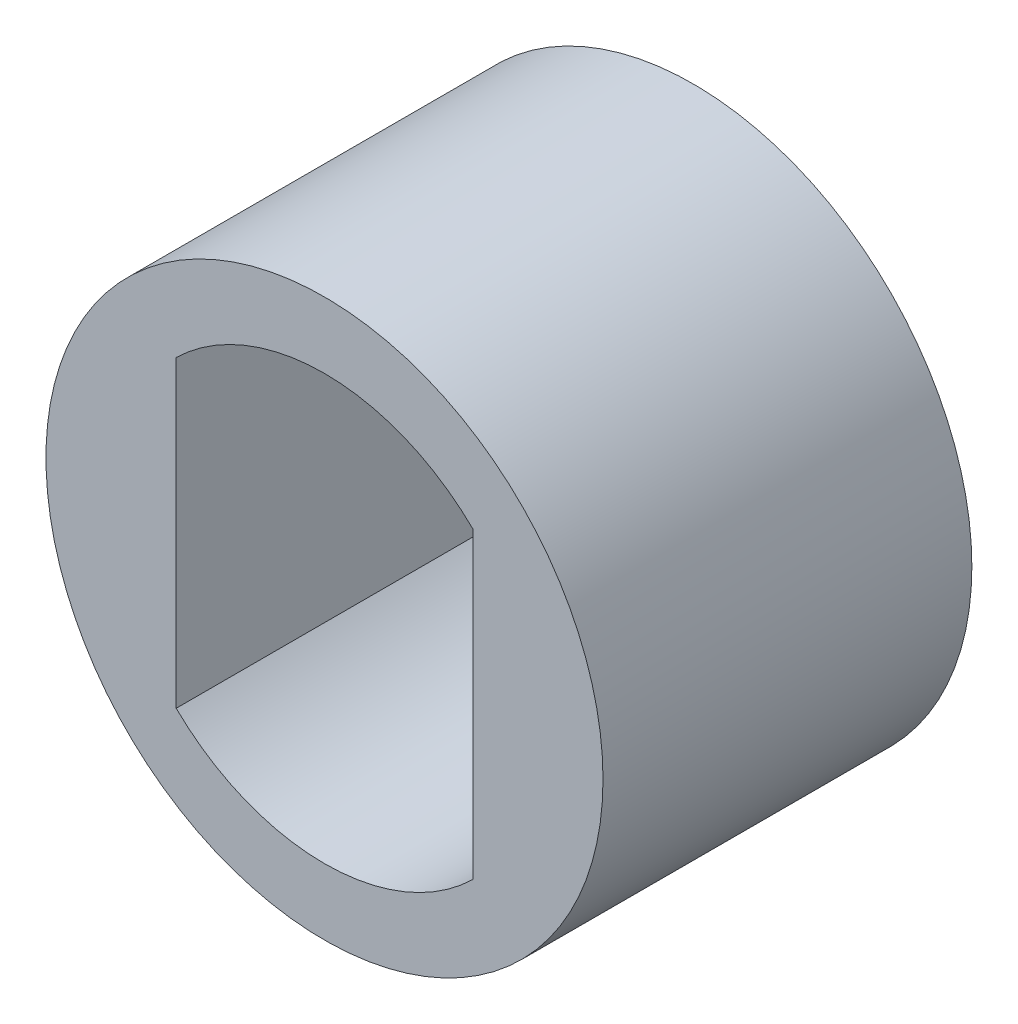
ISO-10303-21;
HEADER;
FILE_DESCRIPTION(('STEP AP214'),'2;1');
FILE_NAME('part.step','',(''),(''),'','','');
FILE_SCHEMA(('AUTOMOTIVE_DESIGN { 1 0 10303 214 1 1 1 1 }'));
ENDSEC;
DATA;
#1=APPLICATION_CONTEXT('core data for automotive mechanical design processes');
#2=APPLICATION_PROTOCOL_DEFINITION('international standard','automotive_design',2000,#1);
#3=PRODUCT_CONTEXT('',#1,'mechanical');
#4=PRODUCT('Part','Part','',(#3));
#5=PRODUCT_RELATED_PRODUCT_CATEGORY('part','',(#4));
#6=PRODUCT_DEFINITION_FORMATION('','',#4);
#7=PRODUCT_DEFINITION_CONTEXT('part definition',#1,'design');
#8=PRODUCT_DEFINITION('design','',#6,#7);
#9=PRODUCT_DEFINITION_SHAPE('','',#8);
#10=(LENGTH_UNIT() NAMED_UNIT(*) SI_UNIT(.MILLI.,.METRE.));
#11=(NAMED_UNIT(*) PLANE_ANGLE_UNIT() SI_UNIT($,.RADIAN.));
#12=(NAMED_UNIT(*) SI_UNIT($,.STERADIAN.) SOLID_ANGLE_UNIT());
#13=UNCERTAINTY_MEASURE_WITH_UNIT(LENGTH_MEASURE(1.E-05),#10,'distance_accuracy_value','');
#14=(GEOMETRIC_REPRESENTATION_CONTEXT(3) GLOBAL_UNCERTAINTY_ASSIGNED_CONTEXT((#13)) GLOBAL_UNIT_ASSIGNED_CONTEXT((#10,
#11,#12)) REPRESENTATION_CONTEXT('',''));
#15=CARTESIAN_POINT('',(0.,0.,0.));
#16=DIRECTION('',(0.,0.,1.));
#17=DIRECTION('',(1.,0.,0.));
#18=AXIS2_PLACEMENT_3D('',#15,#16,#17);
#19=CARTESIAN_POINT('',(0.,0.,4.9));
#20=DIRECTION('',(0.,0.,1.));
#21=DIRECTION('',(1.,0.,0.));
#22=AXIS2_PLACEMENT_3D('',#19,#20,#21);
#23=PLANE('',#22);
#24=CARTESIAN_POINT('',(0.,0.,4.9));
#25=DIRECTION('',(0.,0.,1.));
#26=DIRECTION('',(1.,0.,0.));
#27=AXIS2_PLACEMENT_3D('',#24,#25,#26);
#28=CIRCLE('',#27,3.7);
#29=CARTESIAN_POINT('',(3.7,0.,4.9));
#30=VERTEX_POINT('',#29);
#31=EDGE_CURVE('E11',#30,#30,#28,.T.);
#32=ORIENTED_EDGE('',*,*,#31,.T.);
#33=EDGE_LOOP('',(#32));
#34=FACE_BOUND('',#33,.T.);
#35=DIRECTION('',(0.,1.,0.));
#36=VECTOR('',#35,1.);
#37=CARTESIAN_POINT('',(1.97,-2.01779582713415,4.9));
#38=LINE('',#37,#36);
#39=CARTESIAN_POINT('',(1.97,-2.01779582713415,4.9));
#40=VERTEX_POINT('',#39);
#41=CARTESIAN_POINT('',(1.97,2.01779582713415,4.9));
#42=VERTEX_POINT('',#41);
#43=EDGE_CURVE('E92',#40,#42,#38,.T.);
#44=ORIENTED_EDGE('',*,*,#43,.F.);
#45=CARTESIAN_POINT('',(0.,0.,4.9));
#46=DIRECTION('',(0.,0.,1.));
#47=DIRECTION('',(1.,0.,0.));
#48=AXIS2_PLACEMENT_3D('',#45,#46,#47);
#49=CIRCLE('',#48,2.82);
#50=CARTESIAN_POINT('',(-1.97,-2.01779582713415,4.9));
#51=VERTEX_POINT('',#50);
#52=EDGE_CURVE('E84',#51,#40,#49,.T.);
#53=ORIENTED_EDGE('',*,*,#52,.F.);
#54=DIRECTION('',(0.,-1.,0.));
#55=VECTOR('',#54,1.);
#56=CARTESIAN_POINT('',(-1.97,2.01779582713415,4.9));
#57=LINE('',#56,#55);
#58=CARTESIAN_POINT('',(-1.97,2.01779582713415,4.9));
#59=VERTEX_POINT('',#58);
#60=EDGE_CURVE('E105',#59,#51,#57,.T.);
#61=ORIENTED_EDGE('',*,*,#60,.F.);
#62=CARTESIAN_POINT('',(0.,0.,4.9));
#63=DIRECTION('',(0.,0.,1.));
#64=DIRECTION('',(1.,0.,0.));
#65=AXIS2_PLACEMENT_3D('',#62,#63,#64);
#66=CIRCLE('',#65,2.82);
#67=EDGE_CURVE('E103',#42,#59,#66,.T.);
#68=ORIENTED_EDGE('',*,*,#67,.F.);
#69=EDGE_LOOP('',(#44,#53,#61,#68));
#70=FACE_BOUND('',#69,.T.);
#71=ADVANCED_FACE('F43',(#34,#70),#23,.T.);
#72=CARTESIAN_POINT('',(0.,0.,0.));
#73=DIRECTION('',(0.,0.,1.));
#74=DIRECTION('',(1.,0.,0.));
#75=AXIS2_PLACEMENT_3D('',#72,#73,#74);
#76=PLANE('',#75);
#77=CARTESIAN_POINT('',(0.,0.,0.));
#78=DIRECTION('',(0.,0.,1.));
#79=DIRECTION('',(1.,0.,0.));
#80=AXIS2_PLACEMENT_3D('',#77,#78,#79);
#81=CIRCLE('',#80,3.7);
#82=CARTESIAN_POINT('',(3.7,0.,0.));
#83=VERTEX_POINT('',#82);
#84=EDGE_CURVE('E47',#83,#83,#81,.T.);
#85=ORIENTED_EDGE('',*,*,#84,.F.);
#86=EDGE_LOOP('',(#85));
#87=FACE_BOUND('',#86,.T.);
#88=CARTESIAN_POINT('',(0.,0.,0.));
#89=DIRECTION('',(0.,0.,1.));
#90=DIRECTION('',(1.,0.,0.));
#91=AXIS2_PLACEMENT_3D('',#88,#89,#90);
#92=CIRCLE('',#91,2.82);
#93=CARTESIAN_POINT('',(-1.97,-2.01779582713415,0.));
#94=VERTEX_POINT('',#93);
#95=CARTESIAN_POINT('',(1.97,-2.01779582713415,0.));
#96=VERTEX_POINT('',#95);
#97=EDGE_CURVE('E66',#94,#96,#92,.T.);
#98=ORIENTED_EDGE('',*,*,#97,.T.);
#99=DIRECTION('',(0.,1.,0.));
#100=VECTOR('',#99,1.);
#101=CARTESIAN_POINT('',(1.97,-2.01779582713415,0.));
#102=LINE('',#101,#100);
#103=CARTESIAN_POINT('',(1.97,2.01779582713415,0.));
#104=VERTEX_POINT('',#103);
#105=EDGE_CURVE('E99',#96,#104,#102,.T.);
#106=ORIENTED_EDGE('',*,*,#105,.T.);
#107=CARTESIAN_POINT('',(0.,0.,0.));
#108=DIRECTION('',(0.,0.,1.));
#109=DIRECTION('',(1.,0.,0.));
#110=AXIS2_PLACEMENT_3D('',#107,#108,#109);
#111=CIRCLE('',#110,2.82);
#112=CARTESIAN_POINT('',(-1.97,2.01779582713415,0.));
#113=VERTEX_POINT('',#112);
#114=EDGE_CURVE('E111',#104,#113,#111,.T.);
#115=ORIENTED_EDGE('',*,*,#114,.T.);
#116=DIRECTION('',(0.,-1.,0.));
#117=VECTOR('',#116,1.);
#118=CARTESIAN_POINT('',(-1.97,2.01779582713415,0.));
#119=LINE('',#118,#117);
#120=EDGE_CURVE('E93',#113,#94,#119,.T.);
#121=ORIENTED_EDGE('',*,*,#120,.T.);
#122=EDGE_LOOP('',(#98,#106,#115,#121));
#123=FACE_BOUND('',#122,.T.);
#124=ADVANCED_FACE('F122',(#87,#123),#76,.F.);
#125=CARTESIAN_POINT('',(0.,0.,4.9));
#126=DIRECTION('',(0.,0.,-1.));
#127=DIRECTION('',(-1.,0.,0.));
#128=AXIS2_PLACEMENT_3D('',#125,#126,#127);
#129=CYLINDRICAL_SURFACE('',#128,3.7);
#130=ORIENTED_EDGE('',*,*,#31,.F.);
#131=EDGE_LOOP('',(#130));
#132=FACE_BOUND('',#131,.T.);
#133=ORIENTED_EDGE('',*,*,#84,.T.);
#134=EDGE_LOOP('',(#133));
#135=FACE_BOUND('',#134,.T.);
#136=ADVANCED_FACE('F45',(#132,#135),#129,.T.);
#137=CARTESIAN_POINT('',(0.,0.,4.9));
#138=DIRECTION('',(0.,0.,-1.));
#139=DIRECTION('',(-1.,0.,0.));
#140=AXIS2_PLACEMENT_3D('',#137,#138,#139);
#141=CYLINDRICAL_SURFACE('',#140,2.82);
#142=ORIENTED_EDGE('',*,*,#97,.F.);
#143=DIRECTION('',(0.,0.,-1.));
#144=VECTOR('',#143,1.);
#145=CARTESIAN_POINT('',(-1.97,-2.01779582713415,4.9));
#146=LINE('',#145,#144);
#147=EDGE_CURVE('E88',#51,#94,#146,.T.);
#148=ORIENTED_EDGE('',*,*,#147,.F.);
#149=ORIENTED_EDGE('',*,*,#52,.T.);
#150=DIRECTION('',(0.,0.,-1.));
#151=VECTOR('',#150,1.);
#152=CARTESIAN_POINT('',(1.97,-2.01779582713415,4.9));
#153=LINE('',#152,#151);
#154=EDGE_CURVE('E87',#40,#96,#153,.T.);
#155=ORIENTED_EDGE('',*,*,#154,.T.);
#156=EDGE_LOOP('',(#142,#148,#149,#155));
#157=FACE_BOUND('',#156,.T.);
#158=ADVANCED_FACE('F86',(#157),#141,.F.);
#159=CARTESIAN_POINT('',(1.97,-2.01779582713415,4.9));
#160=DIRECTION('',(-1.,0.,0.));
#161=DIRECTION('',(0.,-1.,0.));
#162=AXIS2_PLACEMENT_3D('',#159,#160,#161);
#163=PLANE('',#162);
#164=ORIENTED_EDGE('',*,*,#105,.F.);
#165=ORIENTED_EDGE('',*,*,#154,.F.);
#166=ORIENTED_EDGE('',*,*,#43,.T.);
#167=DIRECTION('',(0.,0.,-1.));
#168=VECTOR('',#167,1.);
#169=CARTESIAN_POINT('',(1.97,2.01779582713415,4.9));
#170=LINE('',#169,#168);
#171=EDGE_CURVE('E100',#42,#104,#170,.T.);
#172=ORIENTED_EDGE('',*,*,#171,.T.);
#173=EDGE_LOOP('',(#164,#165,#166,#172));
#174=FACE_BOUND('',#173,.T.);
#175=ADVANCED_FACE('F96',(#174),#163,.T.);
#176=CARTESIAN_POINT('',(0.,0.,4.9));
#177=DIRECTION('',(0.,0.,-1.));
#178=DIRECTION('',(-1.,0.,0.));
#179=AXIS2_PLACEMENT_3D('',#176,#177,#178);
#180=CYLINDRICAL_SURFACE('',#179,2.82);
#181=ORIENTED_EDGE('',*,*,#114,.F.);
#182=ORIENTED_EDGE('',*,*,#171,.F.);
#183=ORIENTED_EDGE('',*,*,#67,.T.);
#184=DIRECTION('',(0.,0.,-1.));
#185=VECTOR('',#184,1.);
#186=CARTESIAN_POINT('',(-1.97,2.01779582713415,4.9));
#187=LINE('',#186,#185);
#188=EDGE_CURVE('E58',#59,#113,#187,.T.);
#189=ORIENTED_EDGE('',*,*,#188,.T.);
#190=EDGE_LOOP('',(#181,#182,#183,#189));
#191=FACE_BOUND('',#190,.T.);
#192=ADVANCED_FACE('F120',(#191),#180,.F.);
#193=CARTESIAN_POINT('',(-1.97,2.01779582713415,4.9));
#194=DIRECTION('',(1.,0.,0.));
#195=DIRECTION('',(0.,1.,0.));
#196=AXIS2_PLACEMENT_3D('',#193,#194,#195);
#197=PLANE('',#196);
#198=ORIENTED_EDGE('',*,*,#120,.F.);
#199=ORIENTED_EDGE('',*,*,#188,.F.);
#200=ORIENTED_EDGE('',*,*,#60,.T.);
#201=ORIENTED_EDGE('',*,*,#147,.T.);
#202=EDGE_LOOP('',(#198,#199,#200,#201));
#203=FACE_BOUND('',#202,.T.);
#204=ADVANCED_FACE('F123',(#203),#197,.T.);
#205=CLOSED_SHELL('',(#71,#124,#136,#158,#175,#192,#204));
#206=MANIFOLD_SOLID_BREP('B2',#205);
#207=ADVANCED_BREP_SHAPE_REPRESENTATION('',(#18,#206),#14);
#208=SHAPE_DEFINITION_REPRESENTATION(#9,#207);
ENDSEC;
END-ISO-10303-21;
